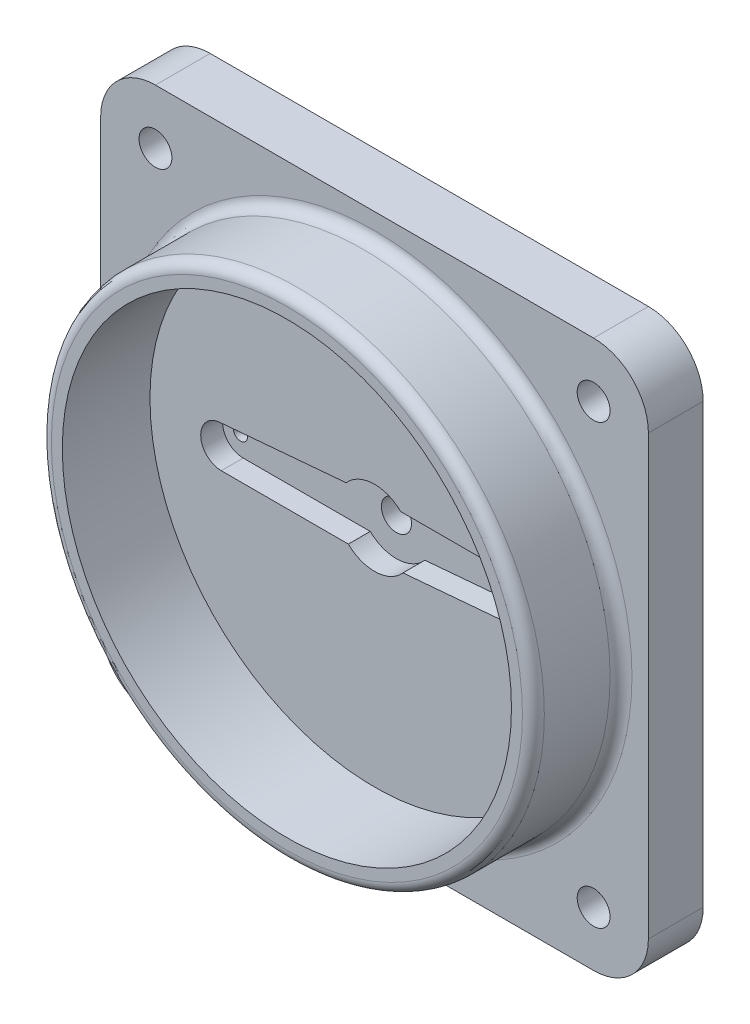
ISO-10303-21;
HEADER;
FILE_DESCRIPTION(('STEP AP214'),'2;1');
FILE_NAME('part.step','',(''),(''),'','','');
FILE_SCHEMA(('AUTOMOTIVE_DESIGN { 1 0 10303 214 1 1 1 1 }'));
ENDSEC;
DATA;
#1=APPLICATION_CONTEXT('core data for automotive mechanical design processes');
#2=APPLICATION_PROTOCOL_DEFINITION('international standard','automotive_design',2000,#1);
#3=PRODUCT_CONTEXT('',#1,'mechanical');
#4=PRODUCT('Part','Part','',(#3));
#5=PRODUCT_RELATED_PRODUCT_CATEGORY('part','',(#4));
#6=PRODUCT_DEFINITION_FORMATION('','',#4);
#7=PRODUCT_DEFINITION_CONTEXT('part definition',#1,'design');
#8=PRODUCT_DEFINITION('design','',#6,#7);
#9=PRODUCT_DEFINITION_SHAPE('','',#8);
#10=(LENGTH_UNIT() NAMED_UNIT(*) SI_UNIT(.MILLI.,.METRE.));
#11=(NAMED_UNIT(*) PLANE_ANGLE_UNIT() SI_UNIT($,.RADIAN.));
#12=(NAMED_UNIT(*) SI_UNIT($,.STERADIAN.) SOLID_ANGLE_UNIT());
#13=UNCERTAINTY_MEASURE_WITH_UNIT(LENGTH_MEASURE(1.E-05),#10,'distance_accuracy_value','');
#14=(GEOMETRIC_REPRESENTATION_CONTEXT(3) GLOBAL_UNCERTAINTY_ASSIGNED_CONTEXT((#13)) GLOBAL_UNIT_ASSIGNED_CONTEXT((#10,
#11,#12)) REPRESENTATION_CONTEXT('',''));
#15=CARTESIAN_POINT('',(0.,0.,0.));
#16=DIRECTION('',(0.,0.,1.));
#17=DIRECTION('',(1.,0.,0.));
#18=AXIS2_PLACEMENT_3D('',#15,#16,#17);
#19=CARTESIAN_POINT('',(0.,0.,6.));
#20=DIRECTION('',(0.,0.,1.));
#21=DIRECTION('',(1.,0.,0.));
#22=AXIS2_PLACEMENT_3D('',#19,#20,#21);
#23=TOROIDAL_SURFACE('',#22,23.5,1.);
#24=CARTESIAN_POINT('',(0.,0.,5.));
#25=DIRECTION('',(0.,0.,1.));
#26=DIRECTION('',(1.,0.,0.));
#27=AXIS2_PLACEMENT_3D('',#24,#25,#26);
#28=CIRCLE('',#27,23.5);
#29=CARTESIAN_POINT('',(23.5,0.,5.));
#30=VERTEX_POINT('',#29);
#31=EDGE_CURVE('E287',#30,#30,#28,.F.);
#32=ORIENTED_EDGE('',*,*,#31,.F.);
#33=EDGE_LOOP('',(#32));
#34=FACE_BOUND('',#33,.T.);
#35=CARTESIAN_POINT('',(0.,0.,6.));
#36=DIRECTION('',(0.,0.,1.));
#37=DIRECTION('',(1.,0.,0.));
#38=AXIS2_PLACEMENT_3D('',#35,#36,#37);
#39=CIRCLE('',#38,22.5);
#40=CARTESIAN_POINT('',(22.5,0.,6.));
#41=VERTEX_POINT('',#40);
#42=EDGE_CURVE('E290',#41,#41,#39,.T.);
#43=ORIENTED_EDGE('',*,*,#42,.F.);
#44=EDGE_LOOP('',(#43));
#45=FACE_BOUND('',#44,.T.);
#46=ADVANCED_FACE('F33',(#34,#45),#23,.F.);
#47=CARTESIAN_POINT('',(25.,25.,5.));
#48=DIRECTION('',(-1.,0.,0.));
#49=DIRECTION('',(0.,-1.,0.));
#50=AXIS2_PLACEMENT_3D('',#47,#48,#49);
#51=PLANE('',#50);
#52=DIRECTION('',(0.,1.,0.));
#53=VECTOR('',#52,1.);
#54=CARTESIAN_POINT('',(25.,25.,0.));
#55=LINE('',#54,#53);
#56=CARTESIAN_POINT('',(25.,-20.,0.));
#57=VERTEX_POINT('',#56);
#58=CARTESIAN_POINT('',(25.,20.,0.));
#59=VERTEX_POINT('',#58);
#60=EDGE_CURVE('E229',#57,#59,#55,.T.);
#61=ORIENTED_EDGE('',*,*,#60,.T.);
#62=DIRECTION('',(0.,0.,-1.));
#63=VECTOR('',#62,1.);
#64=CARTESIAN_POINT('',(25.,20.,5.));
#65=LINE('',#64,#63);
#66=CARTESIAN_POINT('',(25.,20.,5.));
#67=VERTEX_POINT('',#66);
#68=EDGE_CURVE('E269',#59,#67,#65,.F.);
#69=ORIENTED_EDGE('',*,*,#68,.T.);
#70=DIRECTION('',(0.,1.,0.));
#71=VECTOR('',#70,1.);
#72=CARTESIAN_POINT('',(25.,25.,5.));
#73=LINE('',#72,#71);
#74=CARTESIAN_POINT('',(25.,-20.,5.));
#75=VERTEX_POINT('',#74);
#76=EDGE_CURVE('E230',#75,#67,#73,.T.);
#77=ORIENTED_EDGE('',*,*,#76,.F.);
#78=DIRECTION('',(0.,0.,-1.));
#79=VECTOR('',#78,1.);
#80=CARTESIAN_POINT('',(25.,-20.,5.));
#81=LINE('',#80,#79);
#82=EDGE_CURVE('E266',#75,#57,#81,.T.);
#83=ORIENTED_EDGE('',*,*,#82,.T.);
#84=EDGE_LOOP('',(#61,#69,#77,#83));
#85=FACE_BOUND('',#84,.T.);
#86=ADVANCED_FACE('F309',(#85),#51,.F.);
#87=CARTESIAN_POINT('',(-25.,25.,5.));
#88=DIRECTION('',(0.,-1.,0.));
#89=DIRECTION('',(0.,0.,-1.));
#90=AXIS2_PLACEMENT_3D('',#87,#88,#89);
#91=PLANE('',#90);
#92=DIRECTION('',(-1.,0.,0.));
#93=VECTOR('',#92,1.);
#94=CARTESIAN_POINT('',(-25.,25.,5.));
#95=LINE('',#94,#93);
#96=CARTESIAN_POINT('',(20.,25.,5.));
#97=VERTEX_POINT('',#96);
#98=CARTESIAN_POINT('',(-20.,25.,5.));
#99=VERTEX_POINT('',#98);
#100=EDGE_CURVE('E233',#97,#99,#95,.T.);
#101=ORIENTED_EDGE('',*,*,#100,.F.);
#102=DIRECTION('',(0.,0.,-1.));
#103=VECTOR('',#102,1.);
#104=CARTESIAN_POINT('',(20.,25.,5.));
#105=LINE('',#104,#103);
#106=CARTESIAN_POINT('',(20.,25.,0.));
#107=VERTEX_POINT('',#106);
#108=EDGE_CURVE('E255',#97,#107,#105,.T.);
#109=ORIENTED_EDGE('',*,*,#108,.T.);
#110=DIRECTION('',(-1.,0.,0.));
#111=VECTOR('',#110,1.);
#112=CARTESIAN_POINT('',(-25.,25.,0.));
#113=LINE('',#112,#111);
#114=CARTESIAN_POINT('',(-20.,25.,0.));
#115=VERTEX_POINT('',#114);
#116=EDGE_CURVE('E244',#107,#115,#113,.T.);
#117=ORIENTED_EDGE('',*,*,#116,.T.);
#118=DIRECTION('',(0.,0.,-1.));
#119=VECTOR('',#118,1.);
#120=CARTESIAN_POINT('',(-20.,25.,5.));
#121=LINE('',#120,#119);
#122=EDGE_CURVE('E253',#115,#99,#121,.F.);
#123=ORIENTED_EDGE('',*,*,#122,.T.);
#124=EDGE_LOOP('',(#101,#109,#117,#123));
#125=FACE_BOUND('',#124,.T.);
#126=ADVANCED_FACE('F314',(#125),#91,.F.);
#127=CARTESIAN_POINT('',(-25.,25.,5.));
#128=DIRECTION('',(1.,0.,0.));
#129=DIRECTION('',(0.,1.,0.));
#130=AXIS2_PLACEMENT_3D('',#127,#128,#129);
#131=PLANE('',#130);
#132=DIRECTION('',(0.,-1.,0.));
#133=VECTOR('',#132,1.);
#134=CARTESIAN_POINT('',(-25.,25.,0.));
#135=LINE('',#134,#133);
#136=CARTESIAN_POINT('',(-25.,20.,0.));
#137=VERTEX_POINT('',#136);
#138=CARTESIAN_POINT('',(-25.,-20.,0.));
#139=VERTEX_POINT('',#138);
#140=EDGE_CURVE('E247',#137,#139,#135,.T.);
#141=ORIENTED_EDGE('',*,*,#140,.T.);
#142=DIRECTION('',(0.,0.,-1.));
#143=VECTOR('',#142,1.);
#144=CARTESIAN_POINT('',(-25.,-20.,5.));
#145=LINE('',#144,#143);
#146=CARTESIAN_POINT('',(-25.,-20.,5.));
#147=VERTEX_POINT('',#146);
#148=EDGE_CURVE('E285',#139,#147,#145,.F.);
#149=ORIENTED_EDGE('',*,*,#148,.T.);
#150=DIRECTION('',(0.,-1.,0.));
#151=VECTOR('',#150,1.);
#152=CARTESIAN_POINT('',(-25.,25.,5.));
#153=LINE('',#152,#151);
#154=CARTESIAN_POINT('',(-25.,20.,5.));
#155=VERTEX_POINT('',#154);
#156=EDGE_CURVE('E237',#155,#147,#153,.T.);
#157=ORIENTED_EDGE('',*,*,#156,.F.);
#158=DIRECTION('',(0.,0.,-1.));
#159=VECTOR('',#158,1.);
#160=CARTESIAN_POINT('',(-25.,20.,5.));
#161=LINE('',#160,#159);
#162=EDGE_CURVE('E282',#155,#137,#161,.T.);
#163=ORIENTED_EDGE('',*,*,#162,.T.);
#164=EDGE_LOOP('',(#141,#149,#157,#163));
#165=FACE_BOUND('',#164,.T.);
#166=ADVANCED_FACE('F340',(#165),#131,.F.);
#167=CARTESIAN_POINT('',(-25.,-25.,5.));
#168=DIRECTION('',(0.,1.,0.));
#169=DIRECTION('',(0.,0.,1.));
#170=AXIS2_PLACEMENT_3D('',#167,#168,#169);
#171=PLANE('',#170);
#172=DIRECTION('',(1.,0.,0.));
#173=VECTOR('',#172,1.);
#174=CARTESIAN_POINT('',(-25.,-25.,0.));
#175=LINE('',#174,#173);
#176=CARTESIAN_POINT('',(-20.,-25.,0.));
#177=VERTEX_POINT('',#176);
#178=CARTESIAN_POINT('',(20.,-25.,0.));
#179=VERTEX_POINT('',#178);
#180=EDGE_CURVE('E234',#177,#179,#175,.T.);
#181=ORIENTED_EDGE('',*,*,#180,.T.);
#182=DIRECTION('',(0.,0.,-1.));
#183=VECTOR('',#182,1.);
#184=CARTESIAN_POINT('',(20.,-25.,5.));
#185=LINE('',#184,#183);
#186=CARTESIAN_POINT('',(20.,-25.,5.));
#187=VERTEX_POINT('',#186);
#188=EDGE_CURVE('E48',#179,#187,#185,.F.);
#189=ORIENTED_EDGE('',*,*,#188,.T.);
#190=DIRECTION('',(1.,0.,0.));
#191=VECTOR('',#190,1.);
#192=CARTESIAN_POINT('',(-25.,-25.,5.));
#193=LINE('',#192,#191);
#194=CARTESIAN_POINT('',(-20.,-25.,5.));
#195=VERTEX_POINT('',#194);
#196=EDGE_CURVE('E239',#195,#187,#193,.T.);
#197=ORIENTED_EDGE('',*,*,#196,.F.);
#198=DIRECTION('',(0.,0.,-1.));
#199=VECTOR('',#198,1.);
#200=CARTESIAN_POINT('',(-20.,-25.,5.));
#201=LINE('',#200,#199);
#202=EDGE_CURVE('E278',#195,#177,#201,.T.);
#203=ORIENTED_EDGE('',*,*,#202,.T.);
#204=EDGE_LOOP('',(#181,#189,#197,#203));
#205=FACE_BOUND('',#204,.T.);
#206=ADVANCED_FACE('F344',(#205),#171,.F.);
#207=CARTESIAN_POINT('',(0.,0.,5.));
#208=DIRECTION('',(0.,0.,1.));
#209=DIRECTION('',(1.,0.,0.));
#210=AXIS2_PLACEMENT_3D('',#207,#208,#209);
#211=PLANE('',#210);
#212=ORIENTED_EDGE('',*,*,#31,.T.);
#213=EDGE_LOOP('',(#212));
#214=FACE_BOUND('',#213,.T.);
#215=CARTESIAN_POINT('',(-20.,20.,5.));
#216=DIRECTION('',(0.,0.,1.));
#217=DIRECTION('',(1.,0.,0.));
#218=AXIS2_PLACEMENT_3D('',#215,#216,#217);
#219=CIRCLE('',#218,1.5);
#220=CARTESIAN_POINT('',(-18.5,20.,5.));
#221=VERTEX_POINT('',#220);
#222=EDGE_CURVE('E441',#221,#221,#219,.T.);
#223=ORIENTED_EDGE('',*,*,#222,.F.);
#224=EDGE_LOOP('',(#223));
#225=FACE_BOUND('',#224,.T.);
#226=CARTESIAN_POINT('',(20.,20.0000000000011,5.));
#227=DIRECTION('',(0.,0.,1.));
#228=DIRECTION('',(1.,0.,0.));
#229=AXIS2_PLACEMENT_3D('',#226,#227,#228);
#230=CIRCLE('',#229,1.50000000000117);
#231=CARTESIAN_POINT('',(21.5000000000012,20.0000000000011,5.));
#232=VERTEX_POINT('',#231);
#233=EDGE_CURVE('E433',#232,#232,#230,.T.);
#234=ORIENTED_EDGE('',*,*,#233,.F.);
#235=EDGE_LOOP('',(#234));
#236=FACE_BOUND('',#235,.T.);
#237=CARTESIAN_POINT('',(20.0000000000011,-19.9999999999989,5.));
#238=DIRECTION('',(0.,0.,1.));
#239=DIRECTION('',(1.,0.,0.));
#240=AXIS2_PLACEMENT_3D('',#237,#238,#239);
#241=CIRCLE('',#240,1.5000000000016);
#242=CARTESIAN_POINT('',(21.5000000000027,-19.9999999999989,5.));
#243=VERTEX_POINT('',#242);
#244=EDGE_CURVE('E426',#243,#243,#241,.T.);
#245=ORIENTED_EDGE('',*,*,#244,.F.);
#246=EDGE_LOOP('',(#245));
#247=FACE_BOUND('',#246,.T.);
#248=CARTESIAN_POINT('',(-19.9999999999989,-20.,5.));
#249=DIRECTION('',(0.,0.,1.));
#250=DIRECTION('',(1.,0.,0.));
#251=AXIS2_PLACEMENT_3D('',#248,#249,#250);
#252=CIRCLE('',#251,1.5000000000006);
#253=CARTESIAN_POINT('',(-18.4999999999983,-20.,5.));
#254=VERTEX_POINT('',#253);
#255=EDGE_CURVE('E430',#254,#254,#252,.T.);
#256=ORIENTED_EDGE('',*,*,#255,.F.);
#257=EDGE_LOOP('',(#256));
#258=FACE_BOUND('',#257,.T.);
#259=ORIENTED_EDGE('',*,*,#76,.T.);
#260=CARTESIAN_POINT('',(20.,20.,5.));
#261=DIRECTION('',(0.,0.,1.));
#262=DIRECTION('',(1.,0.,0.));
#263=AXIS2_PLACEMENT_3D('',#260,#261,#262);
#264=CIRCLE('',#263,5.);
#265=EDGE_CURVE('E276',#67,#97,#264,.T.);
#266=ORIENTED_EDGE('',*,*,#265,.T.);
#267=ORIENTED_EDGE('',*,*,#100,.T.);
#268=CARTESIAN_POINT('',(-20.,20.,5.));
#269=DIRECTION('',(0.,0.,1.));
#270=DIRECTION('',(1.,0.,0.));
#271=AXIS2_PLACEMENT_3D('',#268,#269,#270);
#272=CIRCLE('',#271,5.);
#273=EDGE_CURVE('E271',#99,#155,#272,.T.);
#274=ORIENTED_EDGE('',*,*,#273,.T.);
#275=ORIENTED_EDGE('',*,*,#156,.T.);
#276=CARTESIAN_POINT('',(-20.,-20.,5.));
#277=DIRECTION('',(0.,0.,1.));
#278=DIRECTION('',(1.,0.,0.));
#279=AXIS2_PLACEMENT_3D('',#276,#277,#278);
#280=CIRCLE('',#279,5.);
#281=EDGE_CURVE('E55',#147,#195,#280,.T.);
#282=ORIENTED_EDGE('',*,*,#281,.T.);
#283=ORIENTED_EDGE('',*,*,#196,.T.);
#284=CARTESIAN_POINT('',(20.,-20.,5.));
#285=DIRECTION('',(0.,0.,1.));
#286=DIRECTION('',(1.,0.,0.));
#287=AXIS2_PLACEMENT_3D('',#284,#285,#286);
#288=CIRCLE('',#287,5.);
#289=EDGE_CURVE('E274',#187,#75,#288,.T.);
#290=ORIENTED_EDGE('',*,*,#289,.T.);
#291=EDGE_LOOP('',(#259,#266,#267,#274,#275,#282,#283,#290));
#292=FACE_BOUND('',#291,.T.);
#293=ADVANCED_FACE('F348',(#214,#225,#236,#247,#258,#292),#211,.T.);
#294=CARTESIAN_POINT('',(0.,0.,0.));
#295=DIRECTION('',(0.,0.,1.));
#296=DIRECTION('',(1.,0.,0.));
#297=AXIS2_PLACEMENT_3D('',#294,#295,#296);
#298=PLANE('',#297);
#299=CARTESIAN_POINT('',(-20.,20.,0.));
#300=DIRECTION('',(0.,0.,1.));
#301=DIRECTION('',(1.,0.,0.));
#302=AXIS2_PLACEMENT_3D('',#299,#300,#301);
#303=CIRCLE('',#302,1.5);
#304=CARTESIAN_POINT('',(-18.5,20.,0.));
#305=VERTEX_POINT('',#304);
#306=EDGE_CURVE('E438',#305,#305,#303,.T.);
#307=ORIENTED_EDGE('',*,*,#306,.T.);
#308=EDGE_LOOP('',(#307));
#309=FACE_BOUND('',#308,.T.);
#310=CARTESIAN_POINT('',(20.,20.0000000000011,0.));
#311=DIRECTION('',(0.,0.,1.));
#312=DIRECTION('',(1.,0.,0.));
#313=AXIS2_PLACEMENT_3D('',#310,#311,#312);
#314=CIRCLE('',#313,1.50000000000117);
#315=CARTESIAN_POINT('',(21.5000000000012,20.0000000000011,0.));
#316=VERTEX_POINT('',#315);
#317=EDGE_CURVE('E428',#316,#316,#314,.T.);
#318=ORIENTED_EDGE('',*,*,#317,.T.);
#319=EDGE_LOOP('',(#318));
#320=FACE_BOUND('',#319,.T.);
#321=CARTESIAN_POINT('',(20.0000000000011,-19.9999999999989,0.));
#322=DIRECTION('',(0.,0.,1.));
#323=DIRECTION('',(1.,0.,0.));
#324=AXIS2_PLACEMENT_3D('',#321,#322,#323);
#325=CIRCLE('',#324,1.5000000000016);
#326=CARTESIAN_POINT('',(21.5000000000027,-19.9999999999989,0.));
#327=VERTEX_POINT('',#326);
#328=EDGE_CURVE('E423',#327,#327,#325,.T.);
#329=ORIENTED_EDGE('',*,*,#328,.T.);
#330=EDGE_LOOP('',(#329));
#331=FACE_BOUND('',#330,.T.);
#332=CARTESIAN_POINT('',(-19.9999999999989,-20.,0.));
#333=DIRECTION('',(0.,0.,1.));
#334=DIRECTION('',(1.,0.,0.));
#335=AXIS2_PLACEMENT_3D('',#332,#333,#334);
#336=CIRCLE('',#335,1.5000000000006);
#337=CARTESIAN_POINT('',(-18.4999999999983,-20.,0.));
#338=VERTEX_POINT('',#337);
#339=EDGE_CURVE('E444',#338,#338,#336,.T.);
#340=ORIENTED_EDGE('',*,*,#339,.T.);
#341=EDGE_LOOP('',(#340));
#342=FACE_BOUND('',#341,.T.);
#343=CARTESIAN_POINT('',(-14.2369072505662,-0.610714285714286,0.));
#344=DIRECTION('',(0.,0.,1.));
#345=DIRECTION('',(1.,0.,0.));
#346=AXIS2_PLACEMENT_3D('',#343,#344,#345);
#347=CIRCLE('',#346,0.650000000000001);
#348=CARTESIAN_POINT('',(-13.5869072505662,-0.610714285714286,0.));
#349=VERTEX_POINT('',#348);
#350=EDGE_CURVE('E197',#349,#349,#347,.T.);
#351=ORIENTED_EDGE('',*,*,#350,.T.);
#352=EDGE_LOOP('',(#351));
#353=FACE_BOUND('',#352,.T.);
#354=CARTESIAN_POINT('',(14.2369072505662,0.610714285714288,0.));
#355=DIRECTION('',(0.,0.,1.));
#356=DIRECTION('',(1.,0.,0.));
#357=AXIS2_PLACEMENT_3D('',#354,#355,#356);
#358=CIRCLE('',#357,0.649999999999999);
#359=CARTESIAN_POINT('',(14.8869072505662,0.610714285714288,0.));
#360=VERTEX_POINT('',#359);
#361=EDGE_CURVE('E454',#360,#360,#358,.T.);
#362=ORIENTED_EDGE('',*,*,#361,.T.);
#363=EDGE_LOOP('',(#362));
#364=FACE_BOUND('',#363,.T.);
#365=CARTESIAN_POINT('',(0.,0.,0.));
#366=DIRECTION('',(0.,0.,1.));
#367=DIRECTION('',(1.,0.,0.));
#368=AXIS2_PLACEMENT_3D('',#365,#366,#367);
#369=CIRCLE('',#368,1.375);
#370=CARTESIAN_POINT('',(1.375,0.,0.));
#371=VERTEX_POINT('',#370);
#372=EDGE_CURVE('E459',#371,#371,#369,.T.);
#373=ORIENTED_EDGE('',*,*,#372,.T.);
#374=EDGE_LOOP('',(#373));
#375=FACE_BOUND('',#374,.T.);
#376=ORIENTED_EDGE('',*,*,#116,.F.);
#377=CARTESIAN_POINT('',(20.,20.,0.));
#378=DIRECTION('',(0.,0.,1.));
#379=DIRECTION('',(1.,0.,0.));
#380=AXIS2_PLACEMENT_3D('',#377,#378,#379);
#381=CIRCLE('',#380,5.);
#382=EDGE_CURVE('E264',#107,#59,#381,.F.);
#383=ORIENTED_EDGE('',*,*,#382,.T.);
#384=ORIENTED_EDGE('',*,*,#60,.F.);
#385=CARTESIAN_POINT('',(20.,-20.,0.));
#386=DIRECTION('',(0.,0.,1.));
#387=DIRECTION('',(1.,0.,0.));
#388=AXIS2_PLACEMENT_3D('',#385,#386,#387);
#389=CIRCLE('',#388,5.);
#390=EDGE_CURVE('E262',#57,#179,#389,.F.);
#391=ORIENTED_EDGE('',*,*,#390,.T.);
#392=ORIENTED_EDGE('',*,*,#180,.F.);
#393=CARTESIAN_POINT('',(-20.,-20.,0.));
#394=DIRECTION('',(0.,0.,1.));
#395=DIRECTION('',(1.,0.,0.));
#396=AXIS2_PLACEMENT_3D('',#393,#394,#395);
#397=CIRCLE('',#396,5.);
#398=EDGE_CURVE('E260',#177,#139,#397,.F.);
#399=ORIENTED_EDGE('',*,*,#398,.T.);
#400=ORIENTED_EDGE('',*,*,#140,.F.);
#401=CARTESIAN_POINT('',(-20.,20.,0.));
#402=DIRECTION('',(0.,0.,1.));
#403=DIRECTION('',(1.,0.,0.));
#404=AXIS2_PLACEMENT_3D('',#401,#402,#403);
#405=CIRCLE('',#404,5.);
#406=EDGE_CURVE('E258',#137,#115,#405,.F.);
#407=ORIENTED_EDGE('',*,*,#406,.T.);
#408=EDGE_LOOP('',(#376,#383,#384,#391,#392,#399,#400,#407));
#409=FACE_BOUND('',#408,.T.);
#410=ADVANCED_FACE('F349',(#309,#320,#331,#342,#353,#364,#375,#409),#298,.F.);
#411=CARTESIAN_POINT('',(0.,0.,13.));
#412=DIRECTION('',(0.,0.,1.));
#413=DIRECTION('',(1.,0.,0.));
#414=AXIS2_PLACEMENT_3D('',#411,#412,#413);
#415=PLANE('',#414);
#416=CARTESIAN_POINT('',(0.,0.,13.));
#417=DIRECTION('',(0.,0.,1.));
#418=DIRECTION('',(1.,0.,0.));
#419=AXIS2_PLACEMENT_3D('',#416,#417,#418);
#420=CIRCLE('',#419,21.5);
#421=CARTESIAN_POINT('',(21.5,0.,13.));
#422=VERTEX_POINT('',#421);
#423=EDGE_CURVE('E41',#422,#422,#420,.T.);
#424=ORIENTED_EDGE('',*,*,#423,.T.);
#425=EDGE_LOOP('',(#424));
#426=FACE_BOUND('',#425,.T.);
#427=CARTESIAN_POINT('',(0.,0.,13.));
#428=DIRECTION('',(0.,0.,1.));
#429=DIRECTION('',(1.,0.,0.));
#430=AXIS2_PLACEMENT_3D('',#427,#428,#429);
#431=CIRCLE('',#430,20.5);
#432=CARTESIAN_POINT('',(20.5,0.,13.));
#433=VERTEX_POINT('',#432);
#434=EDGE_CURVE('E214',#433,#433,#431,.T.);
#435=ORIENTED_EDGE('',*,*,#434,.F.);
#436=EDGE_LOOP('',(#435));
#437=FACE_BOUND('',#436,.T.);
#438=ADVANCED_FACE('F295',(#426,#437),#415,.T.);
#439=CARTESIAN_POINT('',(0.,0.,13.));
#440=DIRECTION('',(0.,0.,-1.));
#441=DIRECTION('',(-1.,0.,0.));
#442=AXIS2_PLACEMENT_3D('',#439,#440,#441);
#443=CYLINDRICAL_SURFACE('',#442,22.5);
#444=CARTESIAN_POINT('',(0.,0.,12.));
#445=DIRECTION('',(0.,0.,1.));
#446=DIRECTION('',(1.,0.,0.));
#447=AXIS2_PLACEMENT_3D('',#444,#445,#446);
#448=CIRCLE('',#447,22.5);
#449=CARTESIAN_POINT('',(22.5,0.,12.));
#450=VERTEX_POINT('',#449);
#451=EDGE_CURVE('E11',#450,#450,#448,.F.);
#452=ORIENTED_EDGE('',*,*,#451,.T.);
#453=EDGE_LOOP('',(#452));
#454=FACE_BOUND('',#453,.T.);
#455=ORIENTED_EDGE('',*,*,#42,.T.);
#456=EDGE_LOOP('',(#455));
#457=FACE_BOUND('',#456,.T.);
#458=ADVANCED_FACE('F357',(#454,#457),#443,.T.);
#459=CARTESIAN_POINT('',(0.,0.,13.));
#460=DIRECTION('',(0.,0.,-1.));
#461=DIRECTION('',(-1.,0.,0.));
#462=AXIS2_PLACEMENT_3D('',#459,#460,#461);
#463=CYLINDRICAL_SURFACE('',#462,20.5);
#464=ORIENTED_EDGE('',*,*,#434,.T.);
#465=EDGE_LOOP('',(#464));
#466=FACE_BOUND('',#465,.T.);
#467=CARTESIAN_POINT('',(0.,0.,5.));
#468=DIRECTION('',(0.,0.,1.));
#469=DIRECTION('',(1.,0.,0.));
#470=AXIS2_PLACEMENT_3D('',#467,#468,#469);
#471=CIRCLE('',#470,20.5);
#472=CARTESIAN_POINT('',(20.5,0.,5.));
#473=VERTEX_POINT('',#472);
#474=EDGE_CURVE('E241',#473,#473,#471,.F.);
#475=ORIENTED_EDGE('',*,*,#474,.T.);
#476=EDGE_LOOP('',(#475));
#477=FACE_BOUND('',#476,.T.);
#478=ADVANCED_FACE('F360',(#466,#477),#463,.F.);
#479=CARTESIAN_POINT('',(-13.9871369479247,-0.6,5.));
#480=DIRECTION('',(0.,0.,1.));
#481=DIRECTION('',(1.,0.,0.));
#482=AXIS2_PLACEMENT_3D('',#479,#480,#481);
#483=CIRCLE('',#482,1.88);
#484=CARTESIAN_POINT('',(-14.148131748713,1.27309387755102,5.));
#485=VERTEX_POINT('',#484);
#486=CARTESIAN_POINT('',(-13.9871369479247,-2.48,5.));
#487=VERTEX_POINT('',#486);
#488=EDGE_CURVE('E155',#485,#487,#483,.T.);
#489=ORIENTED_EDGE('',*,*,#488,.F.);
#490=DIRECTION('',(-0.996326530612245,-0.0856355323342327,0.));
#491=VECTOR('',#490,1.);
#492=CARTESIAN_POINT('',(-14.148131748713,1.27309387755102,5.));
#493=LINE('',#492,#491);
#494=CARTESIAN_POINT('',(-2.59474786174665,2.26612191507015,5.));
#495=VERTEX_POINT('',#494);
#496=EDGE_CURVE('E173',#495,#485,#493,.T.);
#497=ORIENTED_EDGE('',*,*,#496,.F.);
#498=CARTESIAN_POINT('',(0.,0.,5.));
#499=DIRECTION('',(0.,0.,1.));
#500=DIRECTION('',(1.,0.,0.));
#501=AXIS2_PLACEMENT_3D('',#498,#499,#500);
#502=CIRCLE('',#501,3.445);
#503=CARTESIAN_POINT('',(2.39115557837628,2.48,5.));
#504=VERTEX_POINT('',#503);
#505=EDGE_CURVE('E176',#504,#495,#502,.T.);
#506=ORIENTED_EDGE('',*,*,#505,.F.);
#507=DIRECTION('',(-1.,0.,0.));
#508=VECTOR('',#507,1.);
#509=CARTESIAN_POINT('',(13.9871369479247,2.48,5.));
#510=LINE('',#509,#508);
#511=CARTESIAN_POINT('',(13.9871369479247,2.48,5.));
#512=VERTEX_POINT('',#511);
#513=EDGE_CURVE('E208',#512,#504,#510,.T.);
#514=ORIENTED_EDGE('',*,*,#513,.F.);
#515=CARTESIAN_POINT('',(13.9871369479247,0.600000000000002,5.));
#516=DIRECTION('',(0.,0.,1.));
#517=DIRECTION('',(1.,0.,0.));
#518=AXIS2_PLACEMENT_3D('',#515,#516,#517);
#519=CIRCLE('',#518,1.88);
#520=CARTESIAN_POINT('',(14.1134317192059,-1.27575308362989,5.));
#521=VERTEX_POINT('',#520);
#522=EDGE_CURVE('E205',#521,#512,#519,.T.);
#523=ORIENTED_EDGE('',*,*,#522,.F.);
#524=DIRECTION('',(0.996324144246067,0.085663291977035,0.));
#525=VECTOR('',#524,1.);
#526=CARTESIAN_POINT('',(2.59474786174665,-2.26612191507014,5.));
#527=LINE('',#526,#525);
#528=CARTESIAN_POINT('',(2.59474786174665,-2.26612191507014,5.));
#529=VERTEX_POINT('',#528);
#530=EDGE_CURVE('E202',#529,#521,#527,.T.);
#531=ORIENTED_EDGE('',*,*,#530,.F.);
#532=CARTESIAN_POINT('',(0.,0.,5.));
#533=DIRECTION('',(0.,0.,1.));
#534=DIRECTION('',(1.,0.,0.));
#535=AXIS2_PLACEMENT_3D('',#532,#533,#534);
#536=CIRCLE('',#535,3.445);
#537=CARTESIAN_POINT('',(-2.39115557837628,-2.48,5.));
#538=VERTEX_POINT('',#537);
#539=EDGE_CURVE('E199',#538,#529,#536,.T.);
#540=ORIENTED_EDGE('',*,*,#539,.F.);
#541=DIRECTION('',(1.,0.,0.));
#542=VECTOR('',#541,1.);
#543=CARTESIAN_POINT('',(-13.9871369479247,-2.48,5.));
#544=LINE('',#543,#542);
#545=EDGE_CURVE('E196',#487,#538,#544,.T.);
#546=ORIENTED_EDGE('',*,*,#545,.F.);
#547=EDGE_LOOP('',(#489,#497,#506,#514,#523,#531,#540,#546));
#548=FACE_BOUND('',#547,.T.);
#549=ORIENTED_EDGE('',*,*,#474,.F.);
#550=EDGE_LOOP('',(#549));
#551=FACE_BOUND('',#550,.T.);
#552=ADVANCED_FACE('F356',(#548,#551),#211,.T.);
#553=CARTESIAN_POINT('',(-13.9871369479247,-0.6,3.));
#554=DIRECTION('',(0.,0.,1.));
#555=DIRECTION('',(1.,0.,0.));
#556=AXIS2_PLACEMENT_3D('',#553,#554,#555);
#557=CYLINDRICAL_SURFACE('',#556,1.88);
#558=ORIENTED_EDGE('',*,*,#488,.T.);
#559=DIRECTION('',(0.,0.,1.));
#560=VECTOR('',#559,1.);
#561=CARTESIAN_POINT('',(-13.9871369479247,-2.48,3.));
#562=LINE('',#561,#560);
#563=CARTESIAN_POINT('',(-13.9871369479247,-2.48,3.));
#564=VERTEX_POINT('',#563);
#565=EDGE_CURVE('E148',#564,#487,#562,.T.);
#566=ORIENTED_EDGE('',*,*,#565,.F.);
#567=CARTESIAN_POINT('',(-13.9871369479247,-0.6,3.));
#568=DIRECTION('',(0.,0.,1.));
#569=DIRECTION('',(1.,0.,0.));
#570=AXIS2_PLACEMENT_3D('',#567,#568,#569);
#571=CIRCLE('',#570,1.88);
#572=CARTESIAN_POINT('',(-14.148131748713,1.27309387755102,3.));
#573=VERTEX_POINT('',#572);
#574=EDGE_CURVE('E152',#573,#564,#571,.T.);
#575=ORIENTED_EDGE('',*,*,#574,.F.);
#576=DIRECTION('',(0.,0.,1.));
#577=VECTOR('',#576,1.);
#578=CARTESIAN_POINT('',(-14.148131748713,1.27309387755102,3.));
#579=LINE('',#578,#577);
#580=EDGE_CURVE('E212',#573,#485,#579,.T.);
#581=ORIENTED_EDGE('',*,*,#580,.T.);
#582=EDGE_LOOP('',(#558,#566,#575,#581));
#583=FACE_BOUND('',#582,.T.);
#584=ADVANCED_FACE('F150',(#583),#557,.F.);
#585=CARTESIAN_POINT('',(-14.148131748713,1.27309387755102,3.));
#586=DIRECTION('',(-0.0856355323342327,0.996326530612245,0.));
#587=DIRECTION('',(-0.996326530612245,-0.0856355323342327,0.));
#588=AXIS2_PLACEMENT_3D('',#585,#586,#587);
#589=PLANE('',#588);
#590=ORIENTED_EDGE('',*,*,#496,.T.);
#591=ORIENTED_EDGE('',*,*,#580,.F.);
#592=DIRECTION('',(-0.996326530612245,-0.0856355323342327,0.));
#593=VECTOR('',#592,1.);
#594=CARTESIAN_POINT('',(-14.148131748713,1.27309387755102,3.));
#595=LINE('',#594,#593);
#596=CARTESIAN_POINT('',(-2.59474786174665,2.26612191507015,3.));
#597=VERTEX_POINT('',#596);
#598=EDGE_CURVE('E160',#597,#573,#595,.T.);
#599=ORIENTED_EDGE('',*,*,#598,.F.);
#600=DIRECTION('',(0.,0.,1.));
#601=VECTOR('',#600,1.);
#602=CARTESIAN_POINT('',(-2.59474786174665,2.26612191507015,3.));
#603=LINE('',#602,#601);
#604=EDGE_CURVE('E215',#597,#495,#603,.T.);
#605=ORIENTED_EDGE('',*,*,#604,.T.);
#606=EDGE_LOOP('',(#590,#591,#599,#605));
#607=FACE_BOUND('',#606,.T.);
#608=ADVANCED_FACE('F369',(#607),#589,.F.);
#609=CARTESIAN_POINT('',(0.,0.,3.));
#610=DIRECTION('',(0.,0.,1.));
#611=DIRECTION('',(1.,0.,0.));
#612=AXIS2_PLACEMENT_3D('',#609,#610,#611);
#613=CYLINDRICAL_SURFACE('',#612,3.445);
#614=ORIENTED_EDGE('',*,*,#505,.T.);
#615=ORIENTED_EDGE('',*,*,#604,.F.);
#616=CARTESIAN_POINT('',(0.,0.,3.));
#617=DIRECTION('',(0.,0.,1.));
#618=DIRECTION('',(1.,0.,0.));
#619=AXIS2_PLACEMENT_3D('',#616,#617,#618);
#620=CIRCLE('',#619,3.445);
#621=CARTESIAN_POINT('',(2.39115557837628,2.48,3.));
#622=VERTEX_POINT('',#621);
#623=EDGE_CURVE('E192',#622,#597,#620,.T.);
#624=ORIENTED_EDGE('',*,*,#623,.F.);
#625=DIRECTION('',(0.,0.,1.));
#626=VECTOR('',#625,1.);
#627=CARTESIAN_POINT('',(2.39115557837628,2.48,3.));
#628=LINE('',#627,#626);
#629=EDGE_CURVE('E218',#622,#504,#628,.T.);
#630=ORIENTED_EDGE('',*,*,#629,.T.);
#631=EDGE_LOOP('',(#614,#615,#624,#630));
#632=FACE_BOUND('',#631,.T.);
#633=ADVANCED_FACE('F387',(#632),#613,.F.);
#634=CARTESIAN_POINT('',(13.9871369479247,2.48,3.));
#635=DIRECTION('',(0.,1.,0.));
#636=DIRECTION('',(-1.,0.,0.));
#637=AXIS2_PLACEMENT_3D('',#634,#635,#636);
#638=PLANE('',#637);
#639=ORIENTED_EDGE('',*,*,#513,.T.);
#640=ORIENTED_EDGE('',*,*,#629,.F.);
#641=DIRECTION('',(-1.,0.,0.));
#642=VECTOR('',#641,1.);
#643=CARTESIAN_POINT('',(13.9871369479247,2.48,3.));
#644=LINE('',#643,#642);
#645=CARTESIAN_POINT('',(13.9871369479247,2.48,3.));
#646=VERTEX_POINT('',#645);
#647=EDGE_CURVE('E189',#646,#622,#644,.T.);
#648=ORIENTED_EDGE('',*,*,#647,.F.);
#649=DIRECTION('',(0.,0.,1.));
#650=VECTOR('',#649,1.);
#651=CARTESIAN_POINT('',(13.9871369479247,2.48,3.));
#652=LINE('',#651,#650);
#653=EDGE_CURVE('E220',#646,#512,#652,.T.);
#654=ORIENTED_EDGE('',*,*,#653,.T.);
#655=EDGE_LOOP('',(#639,#640,#648,#654));
#656=FACE_BOUND('',#655,.T.);
#657=ADVANCED_FACE('F383',(#656),#638,.F.);
#658=CARTESIAN_POINT('',(13.9871369479247,0.600000000000002,3.));
#659=DIRECTION('',(0.,0.,1.));
#660=DIRECTION('',(1.,0.,0.));
#661=AXIS2_PLACEMENT_3D('',#658,#659,#660);
#662=CYLINDRICAL_SURFACE('',#661,1.88);
#663=ORIENTED_EDGE('',*,*,#522,.T.);
#664=ORIENTED_EDGE('',*,*,#653,.F.);
#665=CARTESIAN_POINT('',(13.9871369479247,0.600000000000002,3.));
#666=DIRECTION('',(0.,0.,1.));
#667=DIRECTION('',(1.,0.,0.));
#668=AXIS2_PLACEMENT_3D('',#665,#666,#667);
#669=CIRCLE('',#668,1.88);
#670=CARTESIAN_POINT('',(14.1134317192059,-1.27575308362989,3.));
#671=VERTEX_POINT('',#670);
#672=EDGE_CURVE('E186',#671,#646,#669,.T.);
#673=ORIENTED_EDGE('',*,*,#672,.F.);
#674=DIRECTION('',(0.,0.,1.));
#675=VECTOR('',#674,1.);
#676=CARTESIAN_POINT('',(14.1134317192059,-1.27575308362989,3.));
#677=LINE('',#676,#675);
#678=EDGE_CURVE('E222',#671,#521,#677,.T.);
#679=ORIENTED_EDGE('',*,*,#678,.T.);
#680=EDGE_LOOP('',(#663,#664,#673,#679));
#681=FACE_BOUND('',#680,.T.);
#682=ADVANCED_FACE('F379',(#681),#662,.F.);
#683=CARTESIAN_POINT('',(2.59474786174665,-2.26612191507014,3.));
#684=DIRECTION('',(0.0856632919770349,-0.996324144246067,0.));
#685=DIRECTION('',(0.996324144246067,0.085663291977035,0.));
#686=AXIS2_PLACEMENT_3D('',#683,#684,#685);
#687=PLANE('',#686);
#688=ORIENTED_EDGE('',*,*,#530,.T.);
#689=ORIENTED_EDGE('',*,*,#678,.F.);
#690=DIRECTION('',(0.996324144246067,0.085663291977035,0.));
#691=VECTOR('',#690,1.);
#692=CARTESIAN_POINT('',(2.59474786174665,-2.26612191507014,3.));
#693=LINE('',#692,#691);
#694=CARTESIAN_POINT('',(2.59474786174665,-2.26612191507014,3.));
#695=VERTEX_POINT('',#694);
#696=EDGE_CURVE('E183',#695,#671,#693,.T.);
#697=ORIENTED_EDGE('',*,*,#696,.F.);
#698=DIRECTION('',(0.,0.,1.));
#699=VECTOR('',#698,1.);
#700=CARTESIAN_POINT('',(2.59474786174665,-2.26612191507014,3.));
#701=LINE('',#700,#699);
#702=EDGE_CURVE('E224',#695,#529,#701,.T.);
#703=ORIENTED_EDGE('',*,*,#702,.T.);
#704=EDGE_LOOP('',(#688,#689,#697,#703));
#705=FACE_BOUND('',#704,.T.);
#706=ADVANCED_FACE('F375',(#705),#687,.F.);
#707=CARTESIAN_POINT('',(0.,0.,3.));
#708=DIRECTION('',(0.,0.,1.));
#709=DIRECTION('',(1.,0.,0.));
#710=AXIS2_PLACEMENT_3D('',#707,#708,#709);
#711=CYLINDRICAL_SURFACE('',#710,3.445);
#712=ORIENTED_EDGE('',*,*,#539,.T.);
#713=ORIENTED_EDGE('',*,*,#702,.F.);
#714=CARTESIAN_POINT('',(0.,0.,3.));
#715=DIRECTION('',(0.,0.,1.));
#716=DIRECTION('',(1.,0.,0.));
#717=AXIS2_PLACEMENT_3D('',#714,#715,#716);
#718=CIRCLE('',#717,3.445);
#719=CARTESIAN_POINT('',(-2.39115557837628,-2.48,3.));
#720=VERTEX_POINT('',#719);
#721=EDGE_CURVE('E168',#720,#695,#718,.T.);
#722=ORIENTED_EDGE('',*,*,#721,.F.);
#723=DIRECTION('',(0.,0.,1.));
#724=VECTOR('',#723,1.);
#725=CARTESIAN_POINT('',(-2.39115557837628,-2.48,3.));
#726=LINE('',#725,#724);
#727=EDGE_CURVE('E159',#720,#538,#726,.T.);
#728=ORIENTED_EDGE('',*,*,#727,.T.);
#729=EDGE_LOOP('',(#712,#713,#722,#728));
#730=FACE_BOUND('',#729,.T.);
#731=ADVANCED_FACE('F372',(#730),#711,.F.);
#732=CARTESIAN_POINT('',(-13.9871369479247,-2.48,3.));
#733=DIRECTION('',(0.,-1.,0.));
#734=DIRECTION('',(1.,0.,0.));
#735=AXIS2_PLACEMENT_3D('',#732,#733,#734);
#736=PLANE('',#735);
#737=ORIENTED_EDGE('',*,*,#545,.T.);
#738=ORIENTED_EDGE('',*,*,#727,.F.);
#739=DIRECTION('',(1.,0.,0.));
#740=VECTOR('',#739,1.);
#741=CARTESIAN_POINT('',(-13.9871369479247,-2.48,3.));
#742=LINE('',#741,#740);
#743=EDGE_CURVE('E163',#564,#720,#742,.T.);
#744=ORIENTED_EDGE('',*,*,#743,.F.);
#745=ORIENTED_EDGE('',*,*,#565,.T.);
#746=EDGE_LOOP('',(#737,#738,#744,#745));
#747=FACE_BOUND('',#746,.T.);
#748=ADVANCED_FACE('F164',(#747),#736,.F.);
#749=CARTESIAN_POINT('',(-13.9871369479247,-0.6,3.));
#750=DIRECTION('',(0.,0.,1.));
#751=DIRECTION('',(1.,0.,0.));
#752=AXIS2_PLACEMENT_3D('',#749,#750,#751);
#753=PLANE('',#752);
#754=CARTESIAN_POINT('',(-14.2369072505662,-0.610714285714286,3.));
#755=DIRECTION('',(0.,0.,1.));
#756=DIRECTION('',(1.,0.,0.));
#757=AXIS2_PLACEMENT_3D('',#754,#755,#756);
#758=CIRCLE('',#757,0.650000000000001);
#759=CARTESIAN_POINT('',(-13.5869072505662,-0.610714285714286,3.));
#760=VERTEX_POINT('',#759);
#761=EDGE_CURVE('E451',#760,#760,#758,.T.);
#762=ORIENTED_EDGE('',*,*,#761,.F.);
#763=EDGE_LOOP('',(#762));
#764=FACE_BOUND('',#763,.T.);
#765=CARTESIAN_POINT('',(14.2369072505662,0.610714285714288,3.));
#766=DIRECTION('',(0.,0.,1.));
#767=DIRECTION('',(1.,0.,0.));
#768=AXIS2_PLACEMENT_3D('',#765,#766,#767);
#769=CIRCLE('',#768,0.649999999999999);
#770=CARTESIAN_POINT('',(14.8869072505662,0.610714285714288,3.));
#771=VERTEX_POINT('',#770);
#772=EDGE_CURVE('E457',#771,#771,#769,.T.);
#773=ORIENTED_EDGE('',*,*,#772,.F.);
#774=EDGE_LOOP('',(#773));
#775=FACE_BOUND('',#774,.T.);
#776=CARTESIAN_POINT('',(0.,0.,3.));
#777=DIRECTION('',(0.,0.,1.));
#778=DIRECTION('',(1.,0.,0.));
#779=AXIS2_PLACEMENT_3D('',#776,#777,#778);
#780=CIRCLE('',#779,1.375);
#781=CARTESIAN_POINT('',(1.375,0.,3.));
#782=VERTEX_POINT('',#781);
#783=EDGE_CURVE('E179',#782,#782,#780,.T.);
#784=ORIENTED_EDGE('',*,*,#783,.F.);
#785=EDGE_LOOP('',(#784));
#786=FACE_BOUND('',#785,.T.);
#787=ORIENTED_EDGE('',*,*,#574,.T.);
#788=ORIENTED_EDGE('',*,*,#743,.T.);
#789=ORIENTED_EDGE('',*,*,#721,.T.);
#790=ORIENTED_EDGE('',*,*,#696,.T.);
#791=ORIENTED_EDGE('',*,*,#672,.T.);
#792=ORIENTED_EDGE('',*,*,#647,.T.);
#793=ORIENTED_EDGE('',*,*,#623,.T.);
#794=ORIENTED_EDGE('',*,*,#598,.T.);
#795=EDGE_LOOP('',(#787,#788,#789,#790,#791,#792,#793,#794));
#796=FACE_BOUND('',#795,.T.);
#797=ADVANCED_FACE('F170',(#764,#775,#786,#796),#753,.T.);
#798=CARTESIAN_POINT('',(0.,0.,0.));
#799=DIRECTION('',(0.,0.,1.));
#800=DIRECTION('',(1.,0.,0.));
#801=AXIS2_PLACEMENT_3D('',#798,#799,#800);
#802=CYLINDRICAL_SURFACE('',#801,1.375);
#803=ORIENTED_EDGE('',*,*,#372,.F.);
#804=EDGE_LOOP('',(#803));
#805=FACE_BOUND('',#804,.T.);
#806=ORIENTED_EDGE('',*,*,#783,.T.);
#807=EDGE_LOOP('',(#806));
#808=FACE_BOUND('',#807,.T.);
#809=ADVANCED_FACE('F397',(#805,#808),#802,.F.);
#810=CARTESIAN_POINT('',(14.2369072505662,0.610714285714288,0.));
#811=DIRECTION('',(0.,0.,1.));
#812=DIRECTION('',(1.,0.,0.));
#813=AXIS2_PLACEMENT_3D('',#810,#811,#812);
#814=CYLINDRICAL_SURFACE('',#813,0.649999999999999);
#815=ORIENTED_EDGE('',*,*,#361,.F.);
#816=EDGE_LOOP('',(#815));
#817=FACE_BOUND('',#816,.T.);
#818=ORIENTED_EDGE('',*,*,#772,.T.);
#819=EDGE_LOOP('',(#818));
#820=FACE_BOUND('',#819,.T.);
#821=ADVANCED_FACE('F401',(#817,#820),#814,.F.);
#822=CARTESIAN_POINT('',(-14.2369072505662,-0.610714285714286,0.));
#823=DIRECTION('',(0.,0.,1.));
#824=DIRECTION('',(1.,0.,0.));
#825=AXIS2_PLACEMENT_3D('',#822,#823,#824);
#826=CYLINDRICAL_SURFACE('',#825,0.650000000000001);
#827=ORIENTED_EDGE('',*,*,#350,.F.);
#828=EDGE_LOOP('',(#827));
#829=FACE_BOUND('',#828,.T.);
#830=ORIENTED_EDGE('',*,*,#761,.T.);
#831=EDGE_LOOP('',(#830));
#832=FACE_BOUND('',#831,.T.);
#833=ADVANCED_FACE('F335',(#829,#832),#826,.F.);
#834=CARTESIAN_POINT('',(20.,20.,5.));
#835=DIRECTION('',(0.,0.,-1.));
#836=DIRECTION('',(-1.,0.,0.));
#837=AXIS2_PLACEMENT_3D('',#834,#835,#836);
#838=CYLINDRICAL_SURFACE('',#837,5.);
#839=ORIENTED_EDGE('',*,*,#265,.F.);
#840=ORIENTED_EDGE('',*,*,#68,.F.);
#841=ORIENTED_EDGE('',*,*,#382,.F.);
#842=ORIENTED_EDGE('',*,*,#108,.F.);
#843=EDGE_LOOP('',(#839,#840,#841,#842));
#844=FACE_BOUND('',#843,.T.);
#845=ADVANCED_FACE('F332',(#844),#838,.T.);
#846=CARTESIAN_POINT('',(20.,-20.,5.));
#847=DIRECTION('',(0.,0.,-1.));
#848=DIRECTION('',(-1.,0.,0.));
#849=AXIS2_PLACEMENT_3D('',#846,#847,#848);
#850=CYLINDRICAL_SURFACE('',#849,5.);
#851=ORIENTED_EDGE('',*,*,#289,.F.);
#852=ORIENTED_EDGE('',*,*,#188,.F.);
#853=ORIENTED_EDGE('',*,*,#390,.F.);
#854=ORIENTED_EDGE('',*,*,#82,.F.);
#855=EDGE_LOOP('',(#851,#852,#853,#854));
#856=FACE_BOUND('',#855,.T.);
#857=ADVANCED_FACE('F328',(#856),#850,.T.);
#858=CARTESIAN_POINT('',(-20.,-20.,5.));
#859=DIRECTION('',(0.,0.,-1.));
#860=DIRECTION('',(-1.,0.,0.));
#861=AXIS2_PLACEMENT_3D('',#858,#859,#860);
#862=CYLINDRICAL_SURFACE('',#861,5.);
#863=ORIENTED_EDGE('',*,*,#281,.F.);
#864=ORIENTED_EDGE('',*,*,#148,.F.);
#865=ORIENTED_EDGE('',*,*,#398,.F.);
#866=ORIENTED_EDGE('',*,*,#202,.F.);
#867=EDGE_LOOP('',(#863,#864,#865,#866));
#868=FACE_BOUND('',#867,.T.);
#869=ADVANCED_FACE('F324',(#868),#862,.T.);
#870=CARTESIAN_POINT('',(-20.,20.,5.));
#871=DIRECTION('',(0.,0.,-1.));
#872=DIRECTION('',(-1.,0.,0.));
#873=AXIS2_PLACEMENT_3D('',#870,#871,#872);
#874=CYLINDRICAL_SURFACE('',#873,5.);
#875=ORIENTED_EDGE('',*,*,#273,.F.);
#876=ORIENTED_EDGE('',*,*,#122,.F.);
#877=ORIENTED_EDGE('',*,*,#406,.F.);
#878=ORIENTED_EDGE('',*,*,#162,.F.);
#879=EDGE_LOOP('',(#875,#876,#877,#878));
#880=FACE_BOUND('',#879,.T.);
#881=ADVANCED_FACE('F320',(#880),#874,.T.);
#882=CARTESIAN_POINT('',(-19.9999999999989,-20.,0.));
#883=DIRECTION('',(0.,0.,1.));
#884=DIRECTION('',(1.,0.,0.));
#885=AXIS2_PLACEMENT_3D('',#882,#883,#884);
#886=CYLINDRICAL_SURFACE('',#885,1.5000000000006);
#887=ORIENTED_EDGE('',*,*,#339,.F.);
#888=EDGE_LOOP('',(#887));
#889=FACE_BOUND('',#888,.T.);
#890=ORIENTED_EDGE('',*,*,#255,.T.);
#891=EDGE_LOOP('',(#890));
#892=FACE_BOUND('',#891,.T.);
#893=ADVANCED_FACE('F323',(#889,#892),#886,.F.);
#894=CARTESIAN_POINT('',(20.0000000000011,-19.9999999999989,0.));
#895=DIRECTION('',(0.,0.,1.));
#896=DIRECTION('',(1.,0.,0.));
#897=AXIS2_PLACEMENT_3D('',#894,#895,#896);
#898=CYLINDRICAL_SURFACE('',#897,1.5000000000016);
#899=ORIENTED_EDGE('',*,*,#328,.F.);
#900=EDGE_LOOP('',(#899));
#901=FACE_BOUND('',#900,.T.);
#902=ORIENTED_EDGE('',*,*,#244,.T.);
#903=EDGE_LOOP('',(#902));
#904=FACE_BOUND('',#903,.T.);
#905=ADVANCED_FACE('F410',(#901,#904),#898,.F.);
#906=CARTESIAN_POINT('',(20.,20.0000000000011,0.));
#907=DIRECTION('',(0.,0.,1.));
#908=DIRECTION('',(1.,0.,0.));
#909=AXIS2_PLACEMENT_3D('',#906,#907,#908);
#910=CYLINDRICAL_SURFACE('',#909,1.50000000000117);
#911=ORIENTED_EDGE('',*,*,#317,.F.);
#912=EDGE_LOOP('',(#911));
#913=FACE_BOUND('',#912,.T.);
#914=ORIENTED_EDGE('',*,*,#233,.T.);
#915=EDGE_LOOP('',(#914));
#916=FACE_BOUND('',#915,.T.);
#917=ADVANCED_FACE('F304',(#913,#916),#910,.F.);
#918=CARTESIAN_POINT('',(-20.,20.,0.));
#919=DIRECTION('',(0.,0.,1.));
#920=DIRECTION('',(1.,0.,0.));
#921=AXIS2_PLACEMENT_3D('',#918,#919,#920);
#922=CYLINDRICAL_SURFACE('',#921,1.5);
#923=ORIENTED_EDGE('',*,*,#306,.F.);
#924=EDGE_LOOP('',(#923));
#925=FACE_BOUND('',#924,.T.);
#926=ORIENTED_EDGE('',*,*,#222,.T.);
#927=EDGE_LOOP('',(#926));
#928=FACE_BOUND('',#927,.T.);
#929=ADVANCED_FACE('F299',(#925,#928),#922,.F.);
#930=CARTESIAN_POINT('',(0.,0.,12.));
#931=DIRECTION('',(0.,0.,1.));
#932=DIRECTION('',(1.,0.,0.));
#933=AXIS2_PLACEMENT_3D('',#930,#931,#932);
#934=TOROIDAL_SURFACE('',#933,21.5,1.);
#935=ORIENTED_EDGE('',*,*,#451,.F.);
#936=EDGE_LOOP('',(#935));
#937=FACE_BOUND('',#936,.T.);
#938=ORIENTED_EDGE('',*,*,#423,.F.);
#939=EDGE_LOOP('',(#938));
#940=FACE_BOUND('',#939,.T.);
#941=ADVANCED_FACE('F35',(#937,#940),#934,.T.);
#942=CLOSED_SHELL('',(#46,#86,#126,#166,#206,#293,#410,#438,#458,#478,#552,#584,#608,#633,#657,
#682,#706,#731,#748,#797,#809,#821,#833,#845,#857,#869,#881,#893,#905,#917,#929,#941));
#943=MANIFOLD_SOLID_BREP('B2',#942);
#944=ADVANCED_BREP_SHAPE_REPRESENTATION('',(#18,#943),#14);
#945=SHAPE_DEFINITION_REPRESENTATION(#9,#944);
ENDSEC;
END-ISO-10303-21;
